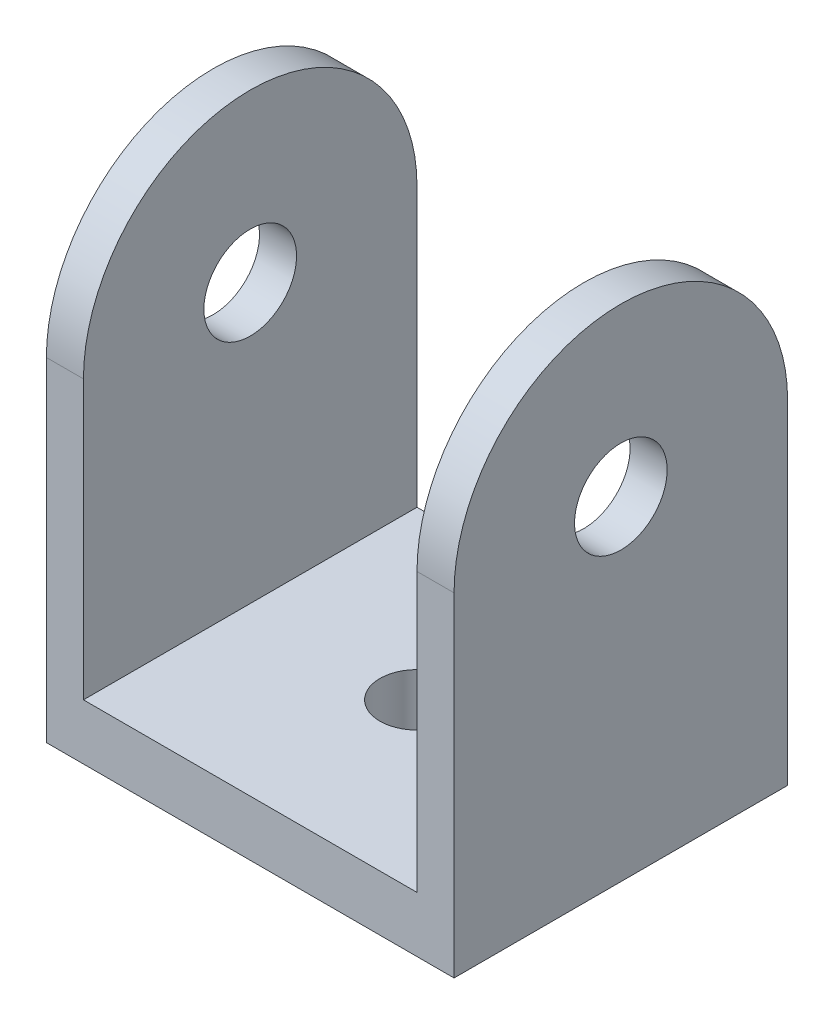
ISO-10303-21;
HEADER;
FILE_DESCRIPTION(('STEP AP214'),'2;1');
FILE_NAME('part.step','',(''),(''),'','','');
FILE_SCHEMA(('AUTOMOTIVE_DESIGN { 1 0 10303 214 1 1 1 1 }'));
ENDSEC;
DATA;
#1=APPLICATION_CONTEXT('core data for automotive mechanical design processes');
#2=APPLICATION_PROTOCOL_DEFINITION('international standard','automotive_design',2000,#1);
#3=PRODUCT_CONTEXT('',#1,'mechanical');
#4=PRODUCT('Part','Part','',(#3));
#5=PRODUCT_RELATED_PRODUCT_CATEGORY('part','',(#4));
#6=PRODUCT_DEFINITION_FORMATION('','',#4);
#7=PRODUCT_DEFINITION_CONTEXT('part definition',#1,'design');
#8=PRODUCT_DEFINITION('design','',#6,#7);
#9=PRODUCT_DEFINITION_SHAPE('','',#8);
#10=(LENGTH_UNIT() NAMED_UNIT(*) SI_UNIT(.MILLI.,.METRE.));
#11=(NAMED_UNIT(*) PLANE_ANGLE_UNIT() SI_UNIT($,.RADIAN.));
#12=(NAMED_UNIT(*) SI_UNIT($,.STERADIAN.) SOLID_ANGLE_UNIT());
#13=UNCERTAINTY_MEASURE_WITH_UNIT(LENGTH_MEASURE(1.E-05),#10,'distance_accuracy_value','');
#14=(GEOMETRIC_REPRESENTATION_CONTEXT(3) GLOBAL_UNCERTAINTY_ASSIGNED_CONTEXT((#13)) GLOBAL_UNIT_ASSIGNED_CONTEXT((#10,
#11,#12)) REPRESENTATION_CONTEXT('',''));
#15=CARTESIAN_POINT('',(0.,0.,0.));
#16=DIRECTION('',(0.,0.,1.));
#17=DIRECTION('',(1.,0.,0.));
#18=AXIS2_PLACEMENT_3D('',#15,#16,#17);
#19=CARTESIAN_POINT('',(11.,3.,-9.));
#20=DIRECTION('',(-1.,0.,0.));
#21=DIRECTION('',(0.,0.,1.));
#22=AXIS2_PLACEMENT_3D('',#19,#20,#21);
#23=PLANE('',#22);
#24=DIRECTION('',(0.,-1.,0.));
#25=VECTOR('',#24,1.);
#26=CARTESIAN_POINT('',(11.,3.,-9.));
#27=LINE('',#26,#25);
#28=CARTESIAN_POINT('',(11.,18.,-9.));
#29=VERTEX_POINT('',#28);
#30=CARTESIAN_POINT('',(11.,0.,-9.));
#31=VERTEX_POINT('',#30);
#32=EDGE_CURVE('E12',#29,#31,#27,.T.);
#33=ORIENTED_EDGE('',*,*,#32,.F.);
#34=CARTESIAN_POINT('',(11.,18.,0.));
#35=DIRECTION('',(-1.,0.,0.));
#36=DIRECTION('',(0.,0.,1.));
#37=AXIS2_PLACEMENT_3D('',#34,#35,#36);
#38=CIRCLE('',#37,9.);
#39=CARTESIAN_POINT('',(11.,18.,9.));
#40=VERTEX_POINT('',#39);
#41=EDGE_CURVE('E149',#29,#40,#38,.F.);
#42=ORIENTED_EDGE('',*,*,#41,.T.);
#43=DIRECTION('',(0.,-1.,0.));
#44=VECTOR('',#43,1.);
#45=CARTESIAN_POINT('',(11.,3.,9.));
#46=LINE('',#45,#44);
#47=CARTESIAN_POINT('',(11.,0.,9.));
#48=VERTEX_POINT('',#47);
#49=EDGE_CURVE('E172',#40,#48,#46,.T.);
#50=ORIENTED_EDGE('',*,*,#49,.T.);
#51=DIRECTION('',(0.,0.,-1.));
#52=VECTOR('',#51,1.);
#53=CARTESIAN_POINT('',(11.,0.,-9.));
#54=LINE('',#53,#52);
#55=EDGE_CURVE('E171',#48,#31,#54,.T.);
#56=ORIENTED_EDGE('',*,*,#55,.T.);
#57=EDGE_LOOP('',(#33,#42,#50,#56));
#58=FACE_BOUND('',#57,.T.);
#59=CARTESIAN_POINT('',(11.,18.,0.));
#60=DIRECTION('',(-1.,0.,0.));
#61=DIRECTION('',(0.,0.,1.));
#62=AXIS2_PLACEMENT_3D('',#59,#60,#61);
#63=CIRCLE('',#62,2.5);
#64=CARTESIAN_POINT('',(11.,18.,2.5));
#65=VERTEX_POINT('',#64);
#66=EDGE_CURVE('E166',#65,#65,#63,.T.);
#67=ORIENTED_EDGE('',*,*,#66,.T.);
#68=EDGE_LOOP('',(#67));
#69=FACE_BOUND('',#68,.T.);
#70=ADVANCED_FACE('F82',(#58,#69),#23,.F.);
#71=CARTESIAN_POINT('',(9.,27.,-9.));
#72=DIRECTION('',(-1.,0.,0.));
#73=DIRECTION('',(0.,0.,1.));
#74=AXIS2_PLACEMENT_3D('',#71,#72,#73);
#75=PLANE('',#74);
#76=CARTESIAN_POINT('',(9.,18.,0.));
#77=DIRECTION('',(-1.,0.,0.));
#78=DIRECTION('',(0.,0.,1.));
#79=AXIS2_PLACEMENT_3D('',#76,#77,#78);
#80=CIRCLE('',#79,9.);
#81=CARTESIAN_POINT('',(9.,18.,9.));
#82=VERTEX_POINT('',#81);
#83=CARTESIAN_POINT('',(9.,18.,-9.));
#84=VERTEX_POINT('',#83);
#85=EDGE_CURVE('E240',#82,#84,#80,.T.);
#86=ORIENTED_EDGE('',*,*,#85,.T.);
#87=DIRECTION('',(0.,-1.,0.));
#88=VECTOR('',#87,1.);
#89=CARTESIAN_POINT('',(9.,27.,-9.));
#90=LINE('',#89,#88);
#91=CARTESIAN_POINT('',(9.,3.,-9.));
#92=VERTEX_POINT('',#91);
#93=EDGE_CURVE('E165',#84,#92,#90,.T.);
#94=ORIENTED_EDGE('',*,*,#93,.T.);
#95=DIRECTION('',(0.,0.,-1.));
#96=VECTOR('',#95,1.);
#97=CARTESIAN_POINT('',(9.,3.,-9.));
#98=LINE('',#97,#96);
#99=CARTESIAN_POINT('',(9.,3.,9.));
#100=VERTEX_POINT('',#99);
#101=EDGE_CURVE('E236',#100,#92,#98,.T.);
#102=ORIENTED_EDGE('',*,*,#101,.F.);
#103=DIRECTION('',(0.,-1.,0.));
#104=VECTOR('',#103,1.);
#105=CARTESIAN_POINT('',(9.,27.,9.));
#106=LINE('',#105,#104);
#107=EDGE_CURVE('E97',#82,#100,#106,.T.);
#108=ORIENTED_EDGE('',*,*,#107,.F.);
#109=EDGE_LOOP('',(#86,#94,#102,#108));
#110=FACE_BOUND('',#109,.T.);
#111=CARTESIAN_POINT('',(9.,18.,0.));
#112=DIRECTION('',(-1.,0.,0.));
#113=DIRECTION('',(0.,0.,1.));
#114=AXIS2_PLACEMENT_3D('',#111,#112,#113);
#115=CIRCLE('',#114,2.5);
#116=CARTESIAN_POINT('',(9.,18.,2.5));
#117=VERTEX_POINT('',#116);
#118=EDGE_CURVE('E158',#117,#117,#115,.F.);
#119=ORIENTED_EDGE('',*,*,#118,.T.);
#120=EDGE_LOOP('',(#119));
#121=FACE_BOUND('',#120,.T.);
#122=ADVANCED_FACE('F238',(#110,#121),#75,.T.);
#123=CARTESIAN_POINT('',(-11.,3.,9.));
#124=DIRECTION('',(0.,0.,-1.));
#125=DIRECTION('',(-1.,0.,0.));
#126=AXIS2_PLACEMENT_3D('',#123,#124,#125);
#127=PLANE('',#126);
#128=DIRECTION('',(1.,0.,0.));
#129=VECTOR('',#128,1.);
#130=CARTESIAN_POINT('',(-13.,18.,9.));
#131=LINE('',#130,#129);
#132=EDGE_CURVE('E154',#82,#40,#131,.T.);
#133=ORIENTED_EDGE('',*,*,#132,.F.);
#134=ORIENTED_EDGE('',*,*,#107,.T.);
#135=DIRECTION('',(1.,0.,0.));
#136=VECTOR('',#135,1.);
#137=CARTESIAN_POINT('',(-11.,3.,9.));
#138=LINE('',#137,#136);
#139=CARTESIAN_POINT('',(-9.,3.,9.));
#140=VERTEX_POINT('',#139);
#141=EDGE_CURVE('E185',#140,#100,#138,.T.);
#142=ORIENTED_EDGE('',*,*,#141,.F.);
#143=DIRECTION('',(0.,-1.,0.));
#144=VECTOR('',#143,1.);
#145=CARTESIAN_POINT('',(-9.,27.,9.));
#146=LINE('',#145,#144);
#147=CARTESIAN_POINT('',(-9.,18.,9.));
#148=VERTEX_POINT('',#147);
#149=EDGE_CURVE('E105',#148,#140,#146,.T.);
#150=ORIENTED_EDGE('',*,*,#149,.F.);
#151=DIRECTION('',(-1.,0.,0.));
#152=VECTOR('',#151,1.);
#153=CARTESIAN_POINT('',(13.,18.,9.));
#154=LINE('',#153,#152);
#155=CARTESIAN_POINT('',(-11.,18.,9.));
#156=VERTEX_POINT('',#155);
#157=EDGE_CURVE('E210',#148,#156,#154,.T.);
#158=ORIENTED_EDGE('',*,*,#157,.T.);
#159=DIRECTION('',(0.,-1.,0.));
#160=VECTOR('',#159,1.);
#161=CARTESIAN_POINT('',(-11.,3.,9.));
#162=LINE('',#161,#160);
#163=CARTESIAN_POINT('',(-11.,0.,9.));
#164=VERTEX_POINT('',#163);
#165=EDGE_CURVE('E194',#156,#164,#162,.T.);
#166=ORIENTED_EDGE('',*,*,#165,.T.);
#167=DIRECTION('',(1.,0.,0.));
#168=VECTOR('',#167,1.);
#169=CARTESIAN_POINT('',(-11.,0.,9.));
#170=LINE('',#169,#168);
#171=EDGE_CURVE('E190',#164,#48,#170,.T.);
#172=ORIENTED_EDGE('',*,*,#171,.T.);
#173=ORIENTED_EDGE('',*,*,#49,.F.);
#174=EDGE_LOOP('',(#133,#134,#142,#150,#158,#166,#172,#173));
#175=FACE_BOUND('',#174,.T.);
#176=ADVANCED_FACE('F207',(#175),#127,.F.);
#177=CARTESIAN_POINT('',(-11.,3.,-9.));
#178=DIRECTION('',(1.,0.,0.));
#179=DIRECTION('',(0.,0.,-1.));
#180=AXIS2_PLACEMENT_3D('',#177,#178,#179);
#181=PLANE('',#180);
#182=DIRECTION('',(0.,-1.,0.));
#183=VECTOR('',#182,1.);
#184=CARTESIAN_POINT('',(-11.,3.,-9.));
#185=LINE('',#184,#183);
#186=CARTESIAN_POINT('',(-11.,18.,-9.));
#187=VERTEX_POINT('',#186);
#188=CARTESIAN_POINT('',(-11.,0.,-9.));
#189=VERTEX_POINT('',#188);
#190=EDGE_CURVE('E90',#187,#189,#185,.T.);
#191=ORIENTED_EDGE('',*,*,#190,.T.);
#192=DIRECTION('',(0.,0.,1.));
#193=VECTOR('',#192,1.);
#194=CARTESIAN_POINT('',(-11.,0.,-9.));
#195=LINE('',#194,#193);
#196=EDGE_CURVE('E179',#189,#164,#195,.T.);
#197=ORIENTED_EDGE('',*,*,#196,.T.);
#198=ORIENTED_EDGE('',*,*,#165,.F.);
#199=CARTESIAN_POINT('',(-11.,18.,0.));
#200=DIRECTION('',(-1.,0.,0.));
#201=DIRECTION('',(0.,0.,1.));
#202=AXIS2_PLACEMENT_3D('',#199,#200,#201);
#203=CIRCLE('',#202,9.);
#204=EDGE_CURVE('E203',#187,#156,#203,.F.);
#205=ORIENTED_EDGE('',*,*,#204,.F.);
#206=EDGE_LOOP('',(#191,#197,#198,#205));
#207=FACE_BOUND('',#206,.T.);
#208=CARTESIAN_POINT('',(-11.,18.,0.));
#209=DIRECTION('',(-1.,0.,0.));
#210=DIRECTION('',(0.,0.,1.));
#211=AXIS2_PLACEMENT_3D('',#208,#209,#210);
#212=CIRCLE('',#211,2.5);
#213=CARTESIAN_POINT('',(-11.,18.,2.5));
#214=VERTEX_POINT('',#213);
#215=EDGE_CURVE('E212',#214,#214,#212,.T.);
#216=ORIENTED_EDGE('',*,*,#215,.F.);
#217=EDGE_LOOP('',(#216));
#218=FACE_BOUND('',#217,.T.);
#219=ADVANCED_FACE('F199',(#207,#218),#181,.F.);
#220=CARTESIAN_POINT('',(-9.,27.,-9.));
#221=DIRECTION('',(-1.,0.,0.));
#222=DIRECTION('',(0.,0.,1.));
#223=AXIS2_PLACEMENT_3D('',#220,#221,#222);
#224=PLANE('',#223);
#225=CARTESIAN_POINT('',(-9.,18.,0.));
#226=DIRECTION('',(-1.,0.,0.));
#227=DIRECTION('',(0.,0.,1.));
#228=AXIS2_PLACEMENT_3D('',#225,#226,#227);
#229=CIRCLE('',#228,9.);
#230=CARTESIAN_POINT('',(-9.,18.,-9.));
#231=VERTEX_POINT('',#230);
#232=EDGE_CURVE('E222',#231,#148,#229,.F.);
#233=ORIENTED_EDGE('',*,*,#232,.T.);
#234=ORIENTED_EDGE('',*,*,#149,.T.);
#235=DIRECTION('',(0.,0.,-1.));
#236=VECTOR('',#235,1.);
#237=CARTESIAN_POINT('',(-9.,3.,-9.));
#238=LINE('',#237,#236);
#239=CARTESIAN_POINT('',(-9.,3.,-9.));
#240=VERTEX_POINT('',#239);
#241=EDGE_CURVE('E224',#140,#240,#238,.T.);
#242=ORIENTED_EDGE('',*,*,#241,.T.);
#243=DIRECTION('',(0.,-1.,0.));
#244=VECTOR('',#243,1.);
#245=CARTESIAN_POINT('',(-9.,27.,-9.));
#246=LINE('',#245,#244);
#247=EDGE_CURVE('E226',#231,#240,#246,.T.);
#248=ORIENTED_EDGE('',*,*,#247,.F.);
#249=EDGE_LOOP('',(#233,#234,#242,#248));
#250=FACE_BOUND('',#249,.T.);
#251=CARTESIAN_POINT('',(-9.,18.,0.));
#252=DIRECTION('',(-1.,0.,0.));
#253=DIRECTION('',(0.,0.,1.));
#254=AXIS2_PLACEMENT_3D('',#251,#252,#253);
#255=CIRCLE('',#254,2.5);
#256=CARTESIAN_POINT('',(-9.,18.,2.5));
#257=VERTEX_POINT('',#256);
#258=EDGE_CURVE('E85',#257,#257,#255,.T.);
#259=ORIENTED_EDGE('',*,*,#258,.T.);
#260=EDGE_LOOP('',(#259));
#261=FACE_BOUND('',#260,.T.);
#262=ADVANCED_FACE('F278',(#250,#261),#224,.F.);
#263=CARTESIAN_POINT('',(0.,3.,0.));
#264=DIRECTION('',(0.,1.,0.));
#265=DIRECTION('',(0.,0.,1.));
#266=AXIS2_PLACEMENT_3D('',#263,#264,#265);
#267=PLANE('',#266);
#268=ORIENTED_EDGE('',*,*,#101,.T.);
#269=DIRECTION('',(-1.,0.,0.));
#270=VECTOR('',#269,1.);
#271=CARTESIAN_POINT('',(-11.,3.,-9.));
#272=LINE('',#271,#270);
#273=EDGE_CURVE('E192',#92,#240,#272,.T.);
#274=ORIENTED_EDGE('',*,*,#273,.T.);
#275=ORIENTED_EDGE('',*,*,#241,.F.);
#276=ORIENTED_EDGE('',*,*,#141,.T.);
#277=EDGE_LOOP('',(#268,#274,#275,#276));
#278=FACE_BOUND('',#277,.T.);
#279=CARTESIAN_POINT('',(0.,3.,0.));
#280=DIRECTION('',(0.,1.,0.));
#281=DIRECTION('',(0.,0.,1.));
#282=AXIS2_PLACEMENT_3D('',#279,#280,#281);
#283=CIRCLE('',#282,2.);
#284=CARTESIAN_POINT('',(0.,3.,2.));
#285=VERTEX_POINT('',#284);
#286=EDGE_CURVE('E177',#285,#285,#283,.T.);
#287=ORIENTED_EDGE('',*,*,#286,.F.);
#288=EDGE_LOOP('',(#287));
#289=FACE_BOUND('',#288,.T.);
#290=ADVANCED_FACE('F234',(#278,#289),#267,.T.);
#291=CARTESIAN_POINT('',(0.,0.,0.));
#292=DIRECTION('',(0.,1.,0.));
#293=DIRECTION('',(0.,0.,1.));
#294=AXIS2_PLACEMENT_3D('',#291,#292,#293);
#295=PLANE('',#294);
#296=ORIENTED_EDGE('',*,*,#55,.F.);
#297=ORIENTED_EDGE('',*,*,#171,.F.);
#298=ORIENTED_EDGE('',*,*,#196,.F.);
#299=DIRECTION('',(-1.,0.,0.));
#300=VECTOR('',#299,1.);
#301=CARTESIAN_POINT('',(-11.,0.,-9.));
#302=LINE('',#301,#300);
#303=EDGE_CURVE('E176',#31,#189,#302,.T.);
#304=ORIENTED_EDGE('',*,*,#303,.F.);
#305=EDGE_LOOP('',(#296,#297,#298,#304));
#306=FACE_BOUND('',#305,.T.);
#307=CARTESIAN_POINT('',(0.,0.,0.));
#308=DIRECTION('',(0.,1.,0.));
#309=DIRECTION('',(0.,0.,1.));
#310=AXIS2_PLACEMENT_3D('',#307,#308,#309);
#311=CIRCLE('',#310,2.);
#312=CARTESIAN_POINT('',(0.,0.,2.));
#313=VERTEX_POINT('',#312);
#314=EDGE_CURVE('E182',#313,#313,#311,.T.);
#315=ORIENTED_EDGE('',*,*,#314,.T.);
#316=EDGE_LOOP('',(#315));
#317=FACE_BOUND('',#316,.T.);
#318=ADVANCED_FACE('F205',(#306,#317),#295,.F.);
#319=CARTESIAN_POINT('',(-11.,3.,-9.));
#320=DIRECTION('',(0.,0.,1.));
#321=DIRECTION('',(1.,0.,0.));
#322=AXIS2_PLACEMENT_3D('',#319,#320,#321);
#323=PLANE('',#322);
#324=ORIENTED_EDGE('',*,*,#93,.F.);
#325=DIRECTION('',(1.,0.,0.));
#326=VECTOR('',#325,1.);
#327=CARTESIAN_POINT('',(-13.,18.,-9.));
#328=LINE('',#327,#326);
#329=EDGE_CURVE('E152',#84,#29,#328,.T.);
#330=ORIENTED_EDGE('',*,*,#329,.T.);
#331=ORIENTED_EDGE('',*,*,#32,.T.);
#332=ORIENTED_EDGE('',*,*,#303,.T.);
#333=ORIENTED_EDGE('',*,*,#190,.F.);
#334=DIRECTION('',(-1.,0.,0.));
#335=VECTOR('',#334,1.);
#336=CARTESIAN_POINT('',(13.,18.,-9.));
#337=LINE('',#336,#335);
#338=EDGE_CURVE('E220',#231,#187,#337,.T.);
#339=ORIENTED_EDGE('',*,*,#338,.F.);
#340=ORIENTED_EDGE('',*,*,#247,.T.);
#341=ORIENTED_EDGE('',*,*,#273,.F.);
#342=EDGE_LOOP('',(#324,#330,#331,#332,#333,#339,#340,#341));
#343=FACE_BOUND('',#342,.T.);
#344=ADVANCED_FACE('F161',(#343),#323,.F.);
#345=CARTESIAN_POINT('',(0.,3.,0.));
#346=DIRECTION('',(0.,-1.,0.));
#347=DIRECTION('',(0.,0.,-1.));
#348=AXIS2_PLACEMENT_3D('',#345,#346,#347);
#349=CYLINDRICAL_SURFACE('',#348,2.);
#350=ORIENTED_EDGE('',*,*,#286,.T.);
#351=EDGE_LOOP('',(#350));
#352=FACE_BOUND('',#351,.T.);
#353=ORIENTED_EDGE('',*,*,#314,.F.);
#354=EDGE_LOOP('',(#353));
#355=FACE_BOUND('',#354,.T.);
#356=ADVANCED_FACE('F277',(#352,#355),#349,.F.);
#357=CARTESIAN_POINT('',(13.,18.,0.));
#358=DIRECTION('',(-1.,0.,0.));
#359=DIRECTION('',(0.,0.,1.));
#360=AXIS2_PLACEMENT_3D('',#357,#358,#359);
#361=CYLINDRICAL_SURFACE('',#360,9.);
#362=ORIENTED_EDGE('',*,*,#157,.F.);
#363=ORIENTED_EDGE('',*,*,#232,.F.);
#364=ORIENTED_EDGE('',*,*,#338,.T.);
#365=ORIENTED_EDGE('',*,*,#204,.T.);
#366=EDGE_LOOP('',(#362,#363,#364,#365));
#367=FACE_BOUND('',#366,.T.);
#368=ADVANCED_FACE('F273',(#367),#361,.T.);
#369=CARTESIAN_POINT('',(13.,18.,0.));
#370=DIRECTION('',(-1.,0.,0.));
#371=DIRECTION('',(0.,0.,1.));
#372=AXIS2_PLACEMENT_3D('',#369,#370,#371);
#373=CYLINDRICAL_SURFACE('',#372,2.5);
#374=ORIENTED_EDGE('',*,*,#215,.T.);
#375=EDGE_LOOP('',(#374));
#376=FACE_BOUND('',#375,.T.);
#377=ORIENTED_EDGE('',*,*,#258,.F.);
#378=EDGE_LOOP('',(#377));
#379=FACE_BOUND('',#378,.T.);
#380=ADVANCED_FACE('F258',(#376,#379),#373,.F.);
#381=CARTESIAN_POINT('',(-13.,18.,0.));
#382=DIRECTION('',(1.,0.,0.));
#383=DIRECTION('',(0.,0.,-1.));
#384=AXIS2_PLACEMENT_3D('',#381,#382,#383);
#385=CYLINDRICAL_SURFACE('',#384,9.);
#386=ORIENTED_EDGE('',*,*,#132,.T.);
#387=ORIENTED_EDGE('',*,*,#41,.F.);
#388=ORIENTED_EDGE('',*,*,#329,.F.);
#389=ORIENTED_EDGE('',*,*,#85,.F.);
#390=EDGE_LOOP('',(#386,#387,#388,#389));
#391=FACE_BOUND('',#390,.T.);
#392=ADVANCED_FACE('F151',(#391),#385,.T.);
#393=CARTESIAN_POINT('',(-13.,18.,0.));
#394=DIRECTION('',(1.,0.,0.));
#395=DIRECTION('',(0.,0.,-1.));
#396=AXIS2_PLACEMENT_3D('',#393,#394,#395);
#397=CYLINDRICAL_SURFACE('',#396,2.5);
#398=ORIENTED_EDGE('',*,*,#118,.F.);
#399=EDGE_LOOP('',(#398));
#400=FACE_BOUND('',#399,.T.);
#401=ORIENTED_EDGE('',*,*,#66,.F.);
#402=EDGE_LOOP('',(#401));
#403=FACE_BOUND('',#402,.T.);
#404=ADVANCED_FACE('F251',(#400,#403),#397,.F.);
#405=CLOSED_SHELL('',(#70,#122,#176,#219,#262,#290,#318,#344,#356,#368,#380,#392,#404));
#406=MANIFOLD_SOLID_BREP('B2',#405);
#407=ADVANCED_BREP_SHAPE_REPRESENTATION('',(#18,#406),#14);
#408=SHAPE_DEFINITION_REPRESENTATION(#9,#407);
ENDSEC;
END-ISO-10303-21;
